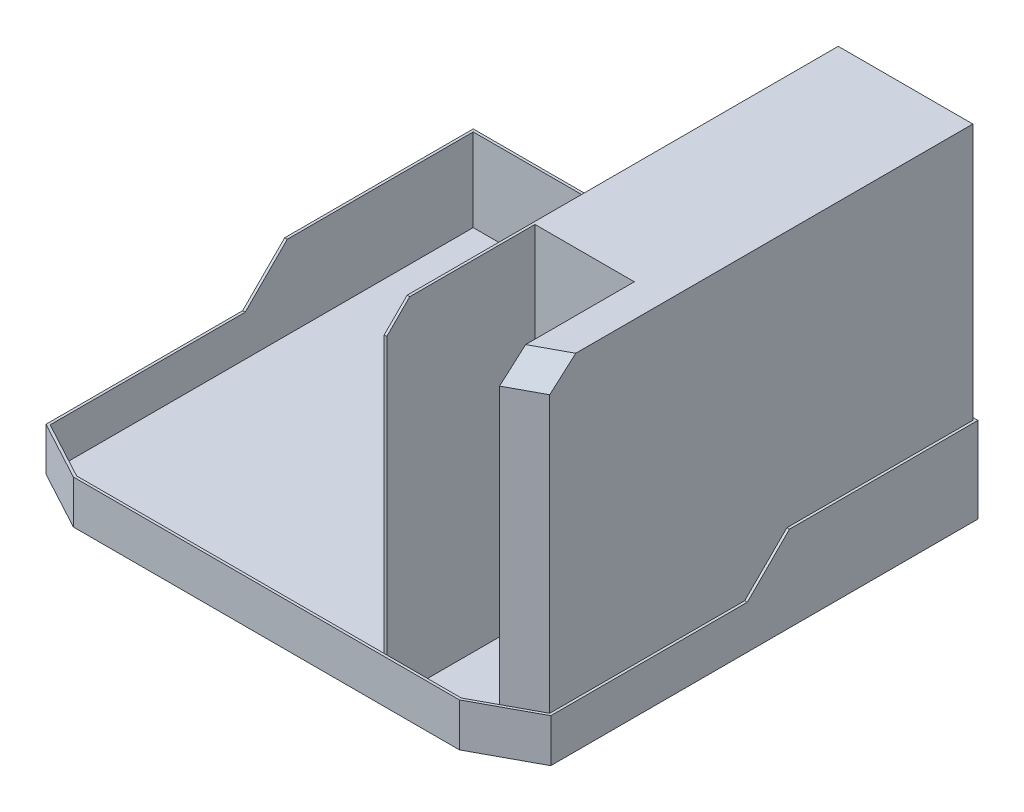
ISO-10303-21;
HEADER;
FILE_DESCRIPTION(('STEP AP214'),'2;1');
FILE_NAME('part.step','',(''),(''),'','','');
FILE_SCHEMA(('AUTOMOTIVE_DESIGN { 1 0 10303 214 1 1 1 1 }'));
ENDSEC;
DATA;
#1=APPLICATION_CONTEXT('core data for automotive mechanical design processes');
#2=APPLICATION_PROTOCOL_DEFINITION('international standard','automotive_design',2000,#1);
#3=PRODUCT_CONTEXT('',#1,'mechanical');
#4=PRODUCT('Part','Part','',(#3));
#5=PRODUCT_RELATED_PRODUCT_CATEGORY('part','',(#4));
#6=PRODUCT_DEFINITION_FORMATION('','',#4);
#7=PRODUCT_DEFINITION_CONTEXT('part definition',#1,'design');
#8=PRODUCT_DEFINITION('design','',#6,#7);
#9=PRODUCT_DEFINITION_SHAPE('','',#8);
#10=(LENGTH_UNIT() NAMED_UNIT(*) SI_UNIT(.MILLI.,.METRE.));
#11=(NAMED_UNIT(*) PLANE_ANGLE_UNIT() SI_UNIT($,.RADIAN.));
#12=(NAMED_UNIT(*) SI_UNIT($,.STERADIAN.) SOLID_ANGLE_UNIT());
#13=UNCERTAINTY_MEASURE_WITH_UNIT(LENGTH_MEASURE(1.E-05),#10,'distance_accuracy_value','');
#14=(GEOMETRIC_REPRESENTATION_CONTEXT(3) GLOBAL_UNCERTAINTY_ASSIGNED_CONTEXT((#13)) GLOBAL_UNIT_ASSIGNED_CONTEXT((#10,
#11,#12)) REPRESENTATION_CONTEXT('',''));
#15=CARTESIAN_POINT('',(0.,0.,0.));
#16=DIRECTION('',(0.,0.,1.));
#17=DIRECTION('',(1.,0.,0.));
#18=AXIS2_PLACEMENT_3D('',#15,#16,#17);
#19=CARTESIAN_POINT('',(319.645467286542,1040.95052293774,298.741286605758));
#20=DIRECTION('',(-0.474433603571063,0.,-0.880291290313936));
#21=DIRECTION('',(-0.880291290313937,0.,0.474433603571063));
#22=AXIS2_PLACEMENT_3D('',#19,#20,#21);
#23=PLANE('',#22);
#24=DIRECTION('',(0.880291290313937,0.,-0.474433603571063));
#25=VECTOR('',#24,1.);
#26=CARTESIAN_POINT('',(319.645467286542,50.,298.741286605758));
#27=LINE('',#26,#25);
#28=CARTESIAN_POINT('',(320.351791073946,50.,298.360612908956));
#29=VERTEX_POINT('',#28);
#30=CARTESIAN_POINT('',(350.876220457634,50.0000000001251,281.909450448529));
#31=VERTEX_POINT('',#30);
#32=EDGE_CURVE('E355',#29,#31,#27,.T.);
#33=ORIENTED_EDGE('',*,*,#32,.T.);
#34=DIRECTION('',(0.,-1.,0.));
#35=VECTOR('',#34,1.);
#36=CARTESIAN_POINT('',(350.876220457634,500000.,281.909450448529));
#37=LINE('',#36,#35);
#38=CARTESIAN_POINT('',(350.876220457634,0.,281.909450448529));
#39=VERTEX_POINT('',#38);
#40=EDGE_CURVE('E300',#31,#39,#37,.T.);
#41=ORIENTED_EDGE('',*,*,#40,.T.);
#42=DIRECTION('',(0.880291290313937,0.,-0.474433603571063));
#43=VECTOR('',#42,1.);
#44=CARTESIAN_POINT('',(319.645467286542,0.,298.741286605758));
#45=LINE('',#44,#43);
#46=CARTESIAN_POINT('',(320.351791073946,0.,298.360612908956));
#47=VERTEX_POINT('',#46);
#48=EDGE_CURVE('E235',#47,#39,#45,.T.);
#49=ORIENTED_EDGE('',*,*,#48,.F.);
#50=DIRECTION('',(0.,-1.,0.));
#51=VECTOR('',#50,1.);
#52=CARTESIAN_POINT('',(320.351791073946,1040.95052293774,298.360612908956));
#53=LINE('',#52,#51);
#54=EDGE_CURVE('E37',#29,#47,#53,.T.);
#55=ORIENTED_EDGE('',*,*,#54,.F.);
#56=EDGE_LOOP('',(#33,#41,#49,#55));
#57=FACE_BOUND('',#56,.T.);
#58=ADVANCED_FACE('F33',(#57),#23,.T.);
#59=CARTESIAN_POINT('',(-152.747945688264,1040.95052293774,298.360612908956));
#60=DIRECTION('',(0.,0.,-1.));
#61=DIRECTION('',(-1.,0.,0.));
#62=AXIS2_PLACEMENT_3D('',#59,#60,#61);
#63=PLANE('',#62);
#64=DIRECTION('',(1.,0.,0.));
#65=VECTOR('',#64,1.);
#66=CARTESIAN_POINT('',(-152.747945688264,50.,298.360612908956));
#67=LINE('',#66,#65);
#68=CARTESIAN_POINT('',(-151.945570616313,50.,298.360612908956));
#69=VERTEX_POINT('',#68);
#70=CARTESIAN_POINT('',(225.65,50.0000000001251,298.360612908956));
#71=VERTEX_POINT('',#70);
#72=EDGE_CURVE('E351',#69,#71,#67,.T.);
#73=ORIENTED_EDGE('',*,*,#72,.T.);
#74=DIRECTION('',(0.,-1.,0.));
#75=VECTOR('',#74,1.);
#76=CARTESIAN_POINT('',(225.65,500000.,298.360612908956));
#77=LINE('',#76,#75);
#78=CARTESIAN_POINT('',(225.65,0.,298.360612908956));
#79=VERTEX_POINT('',#78);
#80=EDGE_CURVE('E257',#71,#79,#77,.T.);
#81=ORIENTED_EDGE('',*,*,#80,.T.);
#82=DIRECTION('',(1.,0.,0.));
#83=VECTOR('',#82,1.);
#84=CARTESIAN_POINT('',(-152.747945688264,0.,298.360612908956));
#85=LINE('',#84,#83);
#86=CARTESIAN_POINT('',(-151.945570616313,0.,298.360612908956));
#87=VERTEX_POINT('',#86);
#88=EDGE_CURVE('E336',#87,#79,#85,.T.);
#89=ORIENTED_EDGE('',*,*,#88,.F.);
#90=DIRECTION('',(0.,-1.,0.));
#91=VECTOR('',#90,1.);
#92=CARTESIAN_POINT('',(-151.945570616313,1040.95052293774,298.360612908956));
#93=LINE('',#92,#91);
#94=EDGE_CURVE('E339',#69,#87,#93,.T.);
#95=ORIENTED_EDGE('',*,*,#94,.F.);
#96=EDGE_LOOP('',(#73,#81,#89,#95));
#97=FACE_BOUND('',#96,.T.);
#98=ADVANCED_FACE('F424',(#97),#63,.T.);
#99=CARTESIAN_POINT('',(228.83,0.,298.360612908956));
#100=VERTEX_POINT('',#99);
#101=EDGE_CURVE('E334',#100,#47,#85,.T.);
#102=ORIENTED_EDGE('',*,*,#101,.F.);
#103=DIRECTION('',(0.,1.,0.));
#104=VECTOR('',#103,1.);
#105=CARTESIAN_POINT('',(228.83,500000.,298.360612908956));
#106=LINE('',#105,#104);
#107=CARTESIAN_POINT('',(228.83,50.0000000000114,298.360612908956));
#108=VERTEX_POINT('',#107);
#109=EDGE_CURVE('E297',#100,#108,#106,.T.);
#110=ORIENTED_EDGE('',*,*,#109,.T.);
#111=EDGE_CURVE('E354',#108,#29,#67,.T.);
#112=ORIENTED_EDGE('',*,*,#111,.T.);
#113=ORIENTED_EDGE('',*,*,#54,.T.);
#114=EDGE_LOOP('',(#102,#110,#112,#113));
#115=FACE_BOUND('',#114,.T.);
#116=ADVANCED_FACE('F447',(#115),#63,.T.);
#117=CARTESIAN_POINT('',(-225.65,370.,-259.07));
#118=DIRECTION('',(0.,0.,-1.));
#119=DIRECTION('',(-1.,0.,0.));
#120=AXIS2_PLACEMENT_3D('',#117,#118,#119);
#121=PLANE('',#120);
#122=DIRECTION('',(0.,-1.,0.));
#123=VECTOR('',#122,1.);
#124=CARTESIAN_POINT('',(225.65,500000.,-259.07));
#125=LINE('',#124,#123);
#126=CARTESIAN_POINT('',(225.65,101.74781650943,-259.07));
#127=VERTEX_POINT('',#126);
#128=CARTESIAN_POINT('',(225.65,0.,-259.07));
#129=VERTEX_POINT('',#128);
#130=EDGE_CURVE('E263',#127,#129,#125,.T.);
#131=ORIENTED_EDGE('',*,*,#130,.F.);
#132=DIRECTION('',(1.,0.,0.));
#133=VECTOR('',#132,1.);
#134=CARTESIAN_POINT('',(-225.65,101.747816509296,-259.07));
#135=LINE('',#134,#133);
#136=CARTESIAN_POINT('',(-222.47,101.747816509296,-259.07));
#137=VERTEX_POINT('',#136);
#138=EDGE_CURVE('E331',#137,#127,#135,.T.);
#139=ORIENTED_EDGE('',*,*,#138,.F.);
#140=DIRECTION('',(0.,-1.,0.));
#141=VECTOR('',#140,1.);
#142=CARTESIAN_POINT('',(-222.47,370.,-259.07));
#143=LINE('',#142,#141);
#144=CARTESIAN_POINT('',(-222.47,0.,-259.07));
#145=VERTEX_POINT('',#144);
#146=EDGE_CURVE('E344',#137,#145,#143,.T.);
#147=ORIENTED_EDGE('',*,*,#146,.T.);
#148=DIRECTION('',(1.,0.,0.));
#149=VECTOR('',#148,1.);
#150=CARTESIAN_POINT('',(-225.65,0.,-259.07));
#151=LINE('',#150,#149);
#152=EDGE_CURVE('E341',#145,#129,#151,.T.);
#153=ORIENTED_EDGE('',*,*,#152,.T.);
#154=EDGE_LOOP('',(#131,#139,#147,#153));
#155=FACE_BOUND('',#154,.T.);
#156=ADVANCED_FACE('F482',(#155),#121,.F.);
#157=CARTESIAN_POINT('',(0.,0.,0.));
#158=DIRECTION('',(0.,1.,0.));
#159=DIRECTION('',(0.,0.,1.));
#160=AXIS2_PLACEMENT_3D('',#157,#158,#159);
#161=PLANE('',#160);
#162=DIRECTION('',(0.,0.,1.));
#163=VECTOR('',#162,1.);
#164=CARTESIAN_POINT('',(225.65,0.,262.25));
#165=LINE('',#164,#163);
#166=CARTESIAN_POINT('',(225.65,0.,262.25));
#167=VERTEX_POINT('',#166);
#168=EDGE_CURVE('E252',#167,#79,#165,.T.);
#169=ORIENTED_EDGE('',*,*,#168,.F.);
#170=DIRECTION('',(0.,0.,1.));
#171=VECTOR('',#170,1.);
#172=CARTESIAN_POINT('',(225.65,0.,-259.07));
#173=LINE('',#172,#171);
#174=EDGE_CURVE('E249',#129,#167,#173,.T.);
#175=ORIENTED_EDGE('',*,*,#174,.F.);
#176=ORIENTED_EDGE('',*,*,#152,.F.);
#177=DIRECTION('',(0.,0.,1.));
#178=VECTOR('',#177,1.);
#179=CARTESIAN_POINT('',(-222.47,0.,-262.25));
#180=LINE('',#179,#178);
#181=CARTESIAN_POINT('',(-222.47,0.,260.351422609727));
#182=VERTEX_POINT('',#181);
#183=EDGE_CURVE('E335',#145,#182,#180,.T.);
#184=ORIENTED_EDGE('',*,*,#183,.T.);
#185=DIRECTION('',(0.880291290313936,0.,0.474433603571064));
#186=VECTOR('',#185,1.);
#187=CARTESIAN_POINT('',(-224.141301140644,0.,259.450673696802));
#188=LINE('',#187,#186);
#189=EDGE_CURVE('E332',#182,#87,#188,.T.);
#190=ORIENTED_EDGE('',*,*,#189,.T.);
#191=ORIENTED_EDGE('',*,*,#88,.T.);
#192=EDGE_LOOP('',(#169,#175,#176,#184,#190,#191));
#193=FACE_BOUND('',#192,.T.);
#194=ADVANCED_FACE('F427',(#193),#161,.T.);
#195=DIRECTION('',(1.,0.,0.));
#196=VECTOR('',#195,1.);
#197=CARTESIAN_POINT('',(228.83,0.,116.46438862178));
#198=LINE('',#197,#196);
#199=CARTESIAN_POINT('',(228.83,0.,116.46438862178));
#200=VERTEX_POINT('',#199);
#201=CARTESIAN_POINT('',(350.876220457634,0.,116.46438862178));
#202=VERTEX_POINT('',#201);
#203=EDGE_CURVE('E228',#200,#202,#198,.T.);
#204=ORIENTED_EDGE('',*,*,#203,.F.);
#205=DIRECTION('',(0.,0.,-1.));
#206=VECTOR('',#205,1.);
#207=CARTESIAN_POINT('',(228.83,0.,116.46438862178));
#208=LINE('',#207,#206);
#209=EDGE_CURVE('E50',#100,#200,#208,.T.);
#210=ORIENTED_EDGE('',*,*,#209,.F.);
#211=ORIENTED_EDGE('',*,*,#101,.T.);
#212=ORIENTED_EDGE('',*,*,#48,.T.);
#213=DIRECTION('',(0.,0.,1.));
#214=VECTOR('',#213,1.);
#215=CARTESIAN_POINT('',(350.876220457634,0.,116.46438862178));
#216=LINE('',#215,#214);
#217=EDGE_CURVE('E218',#202,#39,#216,.T.);
#218=ORIENTED_EDGE('',*,*,#217,.F.);
#219=EDGE_LOOP('',(#204,#210,#211,#212,#218));
#220=FACE_BOUND('',#219,.T.);
#221=ADVANCED_FACE('F233',(#220),#161,.T.);
#222=CARTESIAN_POINT('',(394.066220457634,101.747816509296,-30.8178165092128));
#223=DIRECTION('',(0.,1.,0.));
#224=DIRECTION('',(0.,0.,1.));
#225=AXIS2_PLACEMENT_3D('',#222,#223,#224);
#226=PLANE('',#225);
#227=DIRECTION('',(-1.,0.,0.));
#228=VECTOR('',#227,1.);
#229=CARTESIAN_POINT('',(394.066220457634,101.747816509296,-30.8178165092128));
#230=LINE('',#229,#228);
#231=CARTESIAN_POINT('',(394.056220457634,101.747816509296,-30.8178165092127));
#232=VERTEX_POINT('',#231);
#233=CARTESIAN_POINT('',(390.876220457634,101.747816509296,-30.8178165092127));
#234=VERTEX_POINT('',#233);
#235=EDGE_CURVE('E42',#232,#234,#230,.T.);
#236=ORIENTED_EDGE('',*,*,#235,.F.);
#237=DIRECTION('',(0.,0.,-1.));
#238=VECTOR('',#237,1.);
#239=CARTESIAN_POINT('',(394.056220457634,101.747816509296,262.25));
#240=LINE('',#239,#238);
#241=CARTESIAN_POINT('',(394.056220457634,101.747816509296,-262.25));
#242=VERTEX_POINT('',#241);
#243=EDGE_CURVE('E390',#232,#242,#240,.T.);
#244=ORIENTED_EDGE('',*,*,#243,.T.);
#245=DIRECTION('',(1.,0.,0.));
#246=VECTOR('',#245,1.);
#247=CARTESIAN_POINT('',(-225.65,101.747816509296,-262.25));
#248=LINE('',#247,#246);
#249=CARTESIAN_POINT('',(-225.65,101.747816509296,-262.25));
#250=VERTEX_POINT('',#249);
#251=EDGE_CURVE('E373',#250,#242,#248,.T.);
#252=ORIENTED_EDGE('',*,*,#251,.F.);
#253=DIRECTION('',(0.,0.,1.));
#254=VECTOR('',#253,1.);
#255=CARTESIAN_POINT('',(-225.65,101.747816509296,-262.25));
#256=LINE('',#255,#254);
#257=CARTESIAN_POINT('',(-225.65,101.747816509296,-30.8178165092128));
#258=VERTEX_POINT('',#257);
#259=EDGE_CURVE('E381',#250,#258,#256,.T.);
#260=ORIENTED_EDGE('',*,*,#259,.T.);
#261=CARTESIAN_POINT('',(-222.47,101.747816509296,-30.8178165092128));
#262=VERTEX_POINT('',#261);
#263=EDGE_CURVE('E11',#262,#258,#230,.T.);
#264=ORIENTED_EDGE('',*,*,#263,.F.);
#265=DIRECTION('',(0.,0.,1.));
#266=VECTOR('',#265,1.);
#267=CARTESIAN_POINT('',(-222.47,101.747816509296,-262.25));
#268=LINE('',#267,#266);
#269=EDGE_CURVE('E364',#137,#262,#268,.T.);
#270=ORIENTED_EDGE('',*,*,#269,.F.);
#271=ORIENTED_EDGE('',*,*,#138,.T.);
#272=DIRECTION('',(1.,0.,0.));
#273=VECTOR('',#272,1.);
#274=CARTESIAN_POINT('',(394.066220457634,101.747816509296,-259.07));
#275=LINE('',#274,#273);
#276=CARTESIAN_POINT('',(390.876220457634,101.74781650943,-259.07));
#277=VERTEX_POINT('',#276);
#278=EDGE_CURVE('E304',#127,#277,#275,.T.);
#279=ORIENTED_EDGE('',*,*,#278,.T.);
#280=DIRECTION('',(0.,0.,-1.));
#281=VECTOR('',#280,1.);
#282=CARTESIAN_POINT('',(390.876220457634,101.747816509296,262.25));
#283=LINE('',#282,#281);
#284=EDGE_CURVE('E358',#234,#277,#283,.T.);
#285=ORIENTED_EDGE('',*,*,#284,.F.);
#286=EDGE_LOOP('',(#236,#244,#252,#260,#264,#270,#271,#279,#285));
#287=FACE_BOUND('',#286,.T.);
#288=ADVANCED_FACE('F486',(#287),#226,.T.);
#289=CARTESIAN_POINT('',(394.066220457634,50.,20.9300000000832));
#290=DIRECTION('',(0.,1.,0.));
#291=DIRECTION('',(0.,0.,1.));
#292=AXIS2_PLACEMENT_3D('',#289,#290,#291);
#293=PLANE('',#292);
#294=DIRECTION('',(0.880291290313937,0.,-0.474433603571063));
#295=VECTOR('',#294,1.);
#296=CARTESIAN_POINT('',(321.154166145898,50.,301.540612908956));
#297=LINE('',#296,#295);
#298=CARTESIAN_POINT('',(321.154166145898,50.,301.540612908956));
#299=VERTEX_POINT('',#298);
#300=CARTESIAN_POINT('',(394.056220457634,50.,262.25));
#301=VERTEX_POINT('',#300);
#302=EDGE_CURVE('E393',#299,#301,#297,.T.);
#303=ORIENTED_EDGE('',*,*,#302,.T.);
#304=DIRECTION('',(0.,0.,-1.));
#305=VECTOR('',#304,1.);
#306=CARTESIAN_POINT('',(394.056220457634,50.,262.25));
#307=LINE('',#306,#305);
#308=CARTESIAN_POINT('',(394.056220457634,50.,20.9300000000832));
#309=VERTEX_POINT('',#308);
#310=EDGE_CURVE('E384',#301,#309,#307,.T.);
#311=ORIENTED_EDGE('',*,*,#310,.T.);
#312=DIRECTION('',(-1.,0.,0.));
#313=VECTOR('',#312,1.);
#314=CARTESIAN_POINT('',(394.066220457634,50.,20.9300000000832));
#315=LINE('',#314,#313);
#316=CARTESIAN_POINT('',(390.876220457634,50.,20.9300000000831));
#317=VERTEX_POINT('',#316);
#318=EDGE_CURVE('E348',#309,#317,#315,.T.);
#319=ORIENTED_EDGE('',*,*,#318,.T.);
#320=DIRECTION('',(0.,0.,-1.));
#321=VECTOR('',#320,1.);
#322=CARTESIAN_POINT('',(390.876220457634,50.,262.25));
#323=LINE('',#322,#321);
#324=CARTESIAN_POINT('',(390.876220457634,50.0000000001251,260.351422609727));
#325=VERTEX_POINT('',#324);
#326=EDGE_CURVE('E362',#325,#317,#323,.T.);
#327=ORIENTED_EDGE('',*,*,#326,.F.);
#328=DIRECTION('',(-0.880291290313937,0.,0.474433603571063));
#329=VECTOR('',#328,1.);
#330=CARTESIAN_POINT('',(493.340099794362,50.,205.128443529407));
#331=LINE('',#330,#329);
#332=EDGE_CURVE('E310',#325,#31,#331,.T.);
#333=ORIENTED_EDGE('',*,*,#332,.T.);
#334=ORIENTED_EDGE('',*,*,#32,.F.);
#335=ORIENTED_EDGE('',*,*,#111,.F.);
#336=DIRECTION('',(-1.,0.,0.));
#337=VECTOR('',#336,1.);
#338=CARTESIAN_POINT('',(394.066220457634,50.,298.360612908956));
#339=LINE('',#338,#337);
#340=EDGE_CURVE('E307',#108,#71,#339,.T.);
#341=ORIENTED_EDGE('',*,*,#340,.T.);
#342=ORIENTED_EDGE('',*,*,#72,.F.);
#343=DIRECTION('',(0.880291290313936,0.,0.474433603571064));
#344=VECTOR('',#343,1.);
#345=CARTESIAN_POINT('',(-224.141301140644,50.,259.450673696802));
#346=LINE('',#345,#344);
#347=CARTESIAN_POINT('',(-222.47,50.,260.351422609727));
#348=VERTEX_POINT('',#347);
#349=EDGE_CURVE('E58',#348,#69,#346,.T.);
#350=ORIENTED_EDGE('',*,*,#349,.F.);
#351=DIRECTION('',(0.,0.,1.));
#352=VECTOR('',#351,1.);
#353=CARTESIAN_POINT('',(-222.47,50.,-262.25));
#354=LINE('',#353,#352);
#355=CARTESIAN_POINT('',(-222.47,50.,20.9300000000832));
#356=VERTEX_POINT('',#355);
#357=EDGE_CURVE('E370',#356,#348,#354,.T.);
#358=ORIENTED_EDGE('',*,*,#357,.F.);
#359=CARTESIAN_POINT('',(-225.65,50.,20.9300000000832));
#360=VERTEX_POINT('',#359);
#361=EDGE_CURVE('E346',#356,#360,#315,.T.);
#362=ORIENTED_EDGE('',*,*,#361,.T.);
#363=DIRECTION('',(0.,0.,1.));
#364=VECTOR('',#363,1.);
#365=CARTESIAN_POINT('',(-225.65,50.,-262.25));
#366=LINE('',#365,#364);
#367=CARTESIAN_POINT('',(-225.65,50.,262.25));
#368=VERTEX_POINT('',#367);
#369=EDGE_CURVE('E375',#360,#368,#366,.T.);
#370=ORIENTED_EDGE('',*,*,#369,.T.);
#371=DIRECTION('',(0.880291290313936,0.,0.474433603571064));
#372=VECTOR('',#371,1.);
#373=CARTESIAN_POINT('',(-225.65,50.,262.25));
#374=LINE('',#373,#372);
#375=CARTESIAN_POINT('',(-152.747945688264,50.,301.540612908956));
#376=VERTEX_POINT('',#375);
#377=EDGE_CURVE('E399',#368,#376,#374,.T.);
#378=ORIENTED_EDGE('',*,*,#377,.T.);
#379=DIRECTION('',(1.,0.,0.));
#380=VECTOR('',#379,1.);
#381=CARTESIAN_POINT('',(-152.747945688264,50.,301.540612908956));
#382=LINE('',#381,#380);
#383=EDGE_CURVE('E396',#376,#299,#382,.T.);
#384=ORIENTED_EDGE('',*,*,#383,.T.);
#385=EDGE_LOOP('',(#303,#311,#319,#327,#333,#334,#335,#341,#342,#350,#358,#362,#370,#378,#384));
#386=FACE_BOUND('',#385,.T.);
#387=ADVANCED_FACE('F435',(#386),#293,.T.);
#388=CARTESIAN_POINT('',(394.066220457634,101.747816509296,-30.8178165092128));
#389=DIRECTION('',(0.,0.707106781186548,0.707106781186548));
#390=DIRECTION('',(0.,-0.707106781186548,0.707106781186548));
#391=AXIS2_PLACEMENT_3D('',#388,#389,#390);
#392=PLANE('',#391);
#393=ORIENTED_EDGE('',*,*,#318,.F.);
#394=DIRECTION('',(0.,0.707106781186548,-0.707106781186548));
#395=VECTOR('',#394,1.);
#396=CARTESIAN_POINT('',(394.056220457634,89.3400000000416,-18.4099999999583));
#397=LINE('',#396,#395);
#398=EDGE_CURVE('E387',#309,#232,#397,.T.);
#399=ORIENTED_EDGE('',*,*,#398,.T.);
#400=ORIENTED_EDGE('',*,*,#235,.T.);
#401=DIRECTION('',(0.,0.707106781186548,-0.707106781186548));
#402=VECTOR('',#401,1.);
#403=CARTESIAN_POINT('',(390.876220457634,89.3400000000416,-18.4099999999583));
#404=LINE('',#403,#402);
#405=EDGE_CURVE('E360',#317,#234,#404,.T.);
#406=ORIENTED_EDGE('',*,*,#405,.F.);
#407=EDGE_LOOP('',(#393,#399,#400,#406));
#408=FACE_BOUND('',#407,.T.);
#409=ADVANCED_FACE('F515',(#408),#392,.T.);
#410=DIRECTION('',(0.,-0.707106781186548,0.707106781186548));
#411=VECTOR('',#410,1.);
#412=CARTESIAN_POINT('',(-222.47,351.590000000042,-280.659999999958));
#413=LINE('',#412,#411);
#414=EDGE_CURVE('E367',#262,#356,#413,.T.);
#415=ORIENTED_EDGE('',*,*,#414,.F.);
#416=ORIENTED_EDGE('',*,*,#263,.T.);
#417=DIRECTION('',(0.,-0.707106781186548,0.707106781186548));
#418=VECTOR('',#417,1.);
#419=CARTESIAN_POINT('',(-225.65,351.590000000042,-280.659999999958));
#420=LINE('',#419,#418);
#421=EDGE_CURVE('E378',#258,#360,#420,.T.);
#422=ORIENTED_EDGE('',*,*,#421,.T.);
#423=ORIENTED_EDGE('',*,*,#361,.F.);
#424=EDGE_LOOP('',(#415,#416,#422,#423));
#425=FACE_BOUND('',#424,.T.);
#426=ADVANCED_FACE('F490',(#425),#392,.T.);
#427=CARTESIAN_POINT('',(394.056220457634,370.,262.25));
#428=DIRECTION('',(-1.,0.,0.));
#429=DIRECTION('',(0.,0.,1.));
#430=AXIS2_PLACEMENT_3D('',#427,#428,#429);
#431=PLANE('',#430);
#432=ORIENTED_EDGE('',*,*,#310,.F.);
#433=DIRECTION('',(0.,-1.,0.));
#434=VECTOR('',#433,1.);
#435=CARTESIAN_POINT('',(394.056220457634,370.,262.25));
#436=LINE('',#435,#434);
#437=CARTESIAN_POINT('',(394.056220457634,-3.18,262.25));
#438=VERTEX_POINT('',#437);
#439=EDGE_CURVE('E405',#301,#438,#436,.T.);
#440=ORIENTED_EDGE('',*,*,#439,.T.);
#441=DIRECTION('',(0.,0.,1.));
#442=VECTOR('',#441,1.);
#443=CARTESIAN_POINT('',(394.056220457634,-3.18,262.25));
#444=LINE('',#443,#442);
#445=CARTESIAN_POINT('',(394.056220457634,-3.18,-262.25));
#446=VERTEX_POINT('',#445);
#447=EDGE_CURVE('E328',#446,#438,#444,.T.);
#448=ORIENTED_EDGE('',*,*,#447,.F.);
#449=DIRECTION('',(0.,-1.,0.));
#450=VECTOR('',#449,1.);
#451=CARTESIAN_POINT('',(394.056220457634,370.,-262.25));
#452=LINE('',#451,#450);
#453=EDGE_CURVE('E407',#242,#446,#452,.T.);
#454=ORIENTED_EDGE('',*,*,#453,.F.);
#455=ORIENTED_EDGE('',*,*,#243,.F.);
#456=ORIENTED_EDGE('',*,*,#398,.F.);
#457=EDGE_LOOP('',(#432,#440,#448,#454,#455,#456));
#458=FACE_BOUND('',#457,.T.);
#459=ADVANCED_FACE('F511',(#458),#431,.F.);
#460=CARTESIAN_POINT('',(321.154166145898,1040.95052293774,301.540612908956));
#461=DIRECTION('',(-0.474433603571063,0.,-0.880291290313936));
#462=DIRECTION('',(-0.880291290313937,0.,0.474433603571063));
#463=AXIS2_PLACEMENT_3D('',#460,#461,#462);
#464=PLANE('',#463);
#465=ORIENTED_EDGE('',*,*,#302,.F.);
#466=DIRECTION('',(0.,-1.,0.));
#467=VECTOR('',#466,1.);
#468=CARTESIAN_POINT('',(321.154166145898,1040.95052293774,301.540612908956));
#469=LINE('',#468,#467);
#470=CARTESIAN_POINT('',(321.154166145898,-3.18,301.540612908956));
#471=VERTEX_POINT('',#470);
#472=EDGE_CURVE('E413',#299,#471,#469,.T.);
#473=ORIENTED_EDGE('',*,*,#472,.T.);
#474=DIRECTION('',(-0.880291290313936,0.,0.474433603571063));
#475=VECTOR('',#474,1.);
#476=CARTESIAN_POINT('',(321.154166145898,-3.18,301.540612908956));
#477=LINE('',#476,#475);
#478=EDGE_CURVE('E313',#438,#471,#477,.T.);
#479=ORIENTED_EDGE('',*,*,#478,.F.);
#480=ORIENTED_EDGE('',*,*,#439,.F.);
#481=EDGE_LOOP('',(#465,#473,#479,#480));
#482=FACE_BOUND('',#481,.T.);
#483=ADVANCED_FACE('F506',(#482),#464,.F.);
#484=CARTESIAN_POINT('',(-152.747945688264,1040.95052293774,301.540612908956));
#485=DIRECTION('',(0.,0.,-1.));
#486=DIRECTION('',(-1.,0.,0.));
#487=AXIS2_PLACEMENT_3D('',#484,#485,#486);
#488=PLANE('',#487);
#489=ORIENTED_EDGE('',*,*,#383,.F.);
#490=DIRECTION('',(0.,-1.,0.));
#491=VECTOR('',#490,1.);
#492=CARTESIAN_POINT('',(-152.747945688264,1040.95052293774,301.540612908956));
#493=LINE('',#492,#491);
#494=CARTESIAN_POINT('',(-152.747945688264,-3.18,301.540612908956));
#495=VERTEX_POINT('',#494);
#496=EDGE_CURVE('E411',#376,#495,#493,.T.);
#497=ORIENTED_EDGE('',*,*,#496,.T.);
#498=DIRECTION('',(-1.,0.,0.));
#499=VECTOR('',#498,1.);
#500=CARTESIAN_POINT('',(-152.747945688264,-3.18,301.540612908956));
#501=LINE('',#500,#499);
#502=EDGE_CURVE('E316',#471,#495,#501,.T.);
#503=ORIENTED_EDGE('',*,*,#502,.F.);
#504=ORIENTED_EDGE('',*,*,#472,.F.);
#505=EDGE_LOOP('',(#489,#497,#503,#504));
#506=FACE_BOUND('',#505,.T.);
#507=ADVANCED_FACE('F502',(#506),#488,.F.);
#508=CARTESIAN_POINT('',(-222.47,370.,-262.25));
#509=DIRECTION('',(1.,0.,0.));
#510=DIRECTION('',(0.,0.,-1.));
#511=AXIS2_PLACEMENT_3D('',#508,#509,#510);
#512=PLANE('',#511);
#513=ORIENTED_EDGE('',*,*,#414,.T.);
#514=ORIENTED_EDGE('',*,*,#357,.T.);
#515=DIRECTION('',(0.,-1.,0.));
#516=VECTOR('',#515,1.);
#517=CARTESIAN_POINT('',(-222.47,1040.95052293774,260.351422609727));
#518=LINE('',#517,#516);
#519=EDGE_CURVE('E415',#348,#182,#518,.T.);
#520=ORIENTED_EDGE('',*,*,#519,.T.);
#521=ORIENTED_EDGE('',*,*,#183,.F.);
#522=ORIENTED_EDGE('',*,*,#146,.F.);
#523=ORIENTED_EDGE('',*,*,#269,.T.);
#524=EDGE_LOOP('',(#513,#514,#520,#521,#522,#523));
#525=FACE_BOUND('',#524,.T.);
#526=ADVANCED_FACE('F431',(#525),#512,.T.);
#527=CARTESIAN_POINT('',(-224.141301140644,1040.95052293774,259.450673696802));
#528=DIRECTION('',(0.474433603571064,0.,-0.880291290313936));
#529=DIRECTION('',(-0.880291290313936,0.,-0.474433603571064));
#530=AXIS2_PLACEMENT_3D('',#527,#528,#529);
#531=PLANE('',#530);
#532=ORIENTED_EDGE('',*,*,#519,.F.);
#533=ORIENTED_EDGE('',*,*,#349,.T.);
#534=ORIENTED_EDGE('',*,*,#94,.T.);
#535=ORIENTED_EDGE('',*,*,#189,.F.);
#536=EDGE_LOOP('',(#532,#533,#534,#535));
#537=FACE_BOUND('',#536,.T.);
#538=ADVANCED_FACE('F35',(#537),#531,.T.);
#539=CARTESIAN_POINT('',(-225.65,370.,-262.25));
#540=DIRECTION('',(1.,0.,0.));
#541=DIRECTION('',(0.,0.,-1.));
#542=AXIS2_PLACEMENT_3D('',#539,#540,#541);
#543=PLANE('',#542);
#544=ORIENTED_EDGE('',*,*,#369,.F.);
#545=ORIENTED_EDGE('',*,*,#421,.F.);
#546=ORIENTED_EDGE('',*,*,#259,.F.);
#547=DIRECTION('',(0.,-1.,0.));
#548=VECTOR('',#547,1.);
#549=CARTESIAN_POINT('',(-225.65,370.,-262.25));
#550=LINE('',#549,#548);
#551=CARTESIAN_POINT('',(-225.65,-3.18,-262.25));
#552=VERTEX_POINT('',#551);
#553=EDGE_CURVE('E409',#250,#552,#550,.T.);
#554=ORIENTED_EDGE('',*,*,#553,.T.);
#555=DIRECTION('',(0.,0.,-1.));
#556=VECTOR('',#555,1.);
#557=CARTESIAN_POINT('',(-225.65,-3.18,-262.25));
#558=LINE('',#557,#556);
#559=CARTESIAN_POINT('',(-225.65,-3.18,262.25));
#560=VERTEX_POINT('',#559);
#561=EDGE_CURVE('E322',#560,#552,#558,.T.);
#562=ORIENTED_EDGE('',*,*,#561,.F.);
#563=DIRECTION('',(0.,-1.,0.));
#564=VECTOR('',#563,1.);
#565=CARTESIAN_POINT('',(-225.65,370.,262.25));
#566=LINE('',#565,#564);
#567=EDGE_CURVE('E350',#368,#560,#566,.T.);
#568=ORIENTED_EDGE('',*,*,#567,.F.);
#569=EDGE_LOOP('',(#544,#545,#546,#554,#562,#568));
#570=FACE_BOUND('',#569,.T.);
#571=ADVANCED_FACE('F493',(#570),#543,.F.);
#572=CARTESIAN_POINT('',(-225.65,1040.95052293774,262.25));
#573=DIRECTION('',(0.474433603571064,0.,-0.880291290313936));
#574=DIRECTION('',(-0.880291290313936,0.,-0.474433603571064));
#575=AXIS2_PLACEMENT_3D('',#572,#573,#574);
#576=PLANE('',#575);
#577=ORIENTED_EDGE('',*,*,#377,.F.);
#578=ORIENTED_EDGE('',*,*,#567,.T.);
#579=DIRECTION('',(-0.880291290313936,0.,-0.474433603571064));
#580=VECTOR('',#579,1.);
#581=CARTESIAN_POINT('',(-225.65,-3.18,262.25));
#582=LINE('',#581,#580);
#583=EDGE_CURVE('E319',#495,#560,#582,.T.);
#584=ORIENTED_EDGE('',*,*,#583,.F.);
#585=ORIENTED_EDGE('',*,*,#496,.F.);
#586=EDGE_LOOP('',(#577,#578,#584,#585));
#587=FACE_BOUND('',#586,.T.);
#588=ADVANCED_FACE('F497',(#587),#576,.F.);
#589=CARTESIAN_POINT('',(-225.65,370.,-262.25));
#590=DIRECTION('',(0.,0.,-1.));
#591=DIRECTION('',(-1.,0.,0.));
#592=AXIS2_PLACEMENT_3D('',#589,#590,#591);
#593=PLANE('',#592);
#594=ORIENTED_EDGE('',*,*,#553,.F.);
#595=ORIENTED_EDGE('',*,*,#251,.T.);
#596=ORIENTED_EDGE('',*,*,#453,.T.);
#597=DIRECTION('',(1.,0.,0.));
#598=VECTOR('',#597,1.);
#599=CARTESIAN_POINT('',(-225.65,-3.18,-262.25));
#600=LINE('',#599,#598);
#601=EDGE_CURVE('E325',#552,#446,#600,.T.);
#602=ORIENTED_EDGE('',*,*,#601,.F.);
#603=EDGE_LOOP('',(#594,#595,#596,#602));
#604=FACE_BOUND('',#603,.T.);
#605=ADVANCED_FACE('F545',(#604),#593,.T.);
#606=CARTESIAN_POINT('',(0.,-3.18,0.));
#607=DIRECTION('',(0.,1.,0.));
#608=DIRECTION('',(0.,0.,1.));
#609=AXIS2_PLACEMENT_3D('',#606,#607,#608);
#610=PLANE('',#609);
#611=ORIENTED_EDGE('',*,*,#478,.T.);
#612=ORIENTED_EDGE('',*,*,#502,.T.);
#613=ORIENTED_EDGE('',*,*,#583,.T.);
#614=ORIENTED_EDGE('',*,*,#561,.T.);
#615=ORIENTED_EDGE('',*,*,#601,.T.);
#616=ORIENTED_EDGE('',*,*,#447,.T.);
#617=EDGE_LOOP('',(#611,#612,#613,#614,#615,#616));
#618=FACE_BOUND('',#617,.T.);
#619=ADVANCED_FACE('F552',(#618),#610,.F.);
#620=CARTESIAN_POINT('',(182.92323885521,417.751400435827,339.406257795014));
#621=DIRECTION('',(0.33547521830787,0.707106781186544,0.622459940800443));
#622=DIRECTION('',(-0.880291290313937,0.,0.474433603571063));
#623=AXIS2_PLACEMENT_3D('',#620,#621,#622);
#624=PLANE('',#623);
#625=DIRECTION('',(0.,0.660751107356154,-0.750605072010319));
#626=VECTOR('',#625,1.);
#627=CARTESIAN_POINT('',(350.876220457634,372.857622963304,299.88665649666));
#628=LINE('',#627,#626);
#629=CARTESIAN_POINT('',(350.876220457634,388.682800871777,281.909450448529));
#630=VERTEX_POINT('',#629);
#631=CARTESIAN_POINT('',(350.876220457634,416.82,249.945940826263));
#632=VERTEX_POINT('',#631);
#633=EDGE_CURVE('E244',#630,#632,#628,.T.);
#634=ORIENTED_EDGE('',*,*,#633,.F.);
#635=DIRECTION('',(-0.880291290313936,0.,0.474433603571063));
#636=VECTOR('',#635,1.);
#637=CARTESIAN_POINT('',(196.714359297205,388.682800871653,364.995092812979));
#638=LINE('',#637,#636);
#639=CARTESIAN_POINT('',(390.876220457634,388.682800871777,260.351422609727));
#640=VERTEX_POINT('',#639);
#641=EDGE_CURVE('E270',#640,#630,#638,.T.);
#642=ORIENTED_EDGE('',*,*,#641,.F.);
#643=DIRECTION('',(0.,-0.660751107356154,0.750605072010319));
#644=VECTOR('',#643,1.);
#645=CARTESIAN_POINT('',(390.876220457634,362.165635945463,290.474593448704));
#646=LINE('',#645,#644);
#647=CARTESIAN_POINT('',(390.876220457634,416.82,228.387912987461));
#648=VERTEX_POINT('',#647);
#649=EDGE_CURVE('E282',#648,#640,#646,.T.);
#650=ORIENTED_EDGE('',*,*,#649,.F.);
#651=DIRECTION('',(0.880291290313936,0.,-0.474433603571063));
#652=VECTOR('',#651,1.);
#653=CARTESIAN_POINT('',(183.365126520347,416.82,340.226161486467));
#654=LINE('',#653,#652);
#655=EDGE_CURVE('E274',#632,#648,#654,.T.);
#656=ORIENTED_EDGE('',*,*,#655,.F.);
#657=EDGE_LOOP('',(#634,#642,#650,#656));
#658=FACE_BOUND('',#657,.T.);
#659=ADVANCED_FACE('F467',(#658),#624,.T.);
#660=CARTESIAN_POINT('',(0.,417.751400435827,269.292013344783));
#661=DIRECTION('',(0.,0.707106781186544,0.707106781186551));
#662=DIRECTION('',(-1.,0.,0.));
#663=AXIS2_PLACEMENT_3D('',#660,#661,#662);
#664=PLANE('',#663);
#665=DIRECTION('',(0.,-0.707106781186551,0.707106781186544));
#666=VECTOR('',#665,1.);
#667=CARTESIAN_POINT('',(228.83,417.751400435827,269.292013344783));
#668=LINE('',#667,#666);
#669=CARTESIAN_POINT('',(228.83,416.82,270.223413780609));
#670=VERTEX_POINT('',#669);
#671=CARTESIAN_POINT('',(228.83,388.682800871653,298.360612908956));
#672=VERTEX_POINT('',#671);
#673=EDGE_CURVE('E224',#670,#672,#668,.T.);
#674=ORIENTED_EDGE('',*,*,#673,.F.);
#675=DIRECTION('',(1.,0.,0.));
#676=VECTOR('',#675,1.);
#677=CARTESIAN_POINT('',(0.,416.82,270.223413780609));
#678=LINE('',#677,#676);
#679=CARTESIAN_POINT('',(225.65,416.819999999973,270.223413780609));
#680=VERTEX_POINT('',#679);
#681=EDGE_CURVE('E288',#680,#670,#678,.T.);
#682=ORIENTED_EDGE('',*,*,#681,.F.);
#683=DIRECTION('',(0.,-0.707106781186551,0.707106781186544));
#684=VECTOR('',#683,1.);
#685=CARTESIAN_POINT('',(225.65,250212.396706893,-249525.35329311));
#686=LINE('',#685,#684);
#687=CARTESIAN_POINT('',(225.65,388.682800871777,298.360612908956));
#688=VERTEX_POINT('',#687);
#689=EDGE_CURVE('E275',#680,#688,#686,.T.);
#690=ORIENTED_EDGE('',*,*,#689,.T.);
#691=DIRECTION('',(-1.,0.,0.));
#692=VECTOR('',#691,1.);
#693=CARTESIAN_POINT('',(0.,388.682800871653,298.360612908956));
#694=LINE('',#693,#692);
#695=EDGE_CURVE('E280',#672,#688,#694,.T.);
#696=ORIENTED_EDGE('',*,*,#695,.F.);
#697=EDGE_LOOP('',(#674,#682,#690,#696));
#698=FACE_BOUND('',#697,.T.);
#699=ADVANCED_FACE('F473',(#698),#664,.T.);
#700=CARTESIAN_POINT('',(0.,416.82,0.));
#701=DIRECTION('',(0.,1.,0.));
#702=DIRECTION('',(0.,0.,1.));
#703=AXIS2_PLACEMENT_3D('',#700,#701,#702);
#704=PLANE('',#703);
#705=DIRECTION('',(0.,0.,1.));
#706=VECTOR('',#705,1.);
#707=CARTESIAN_POINT('',(228.83,416.82,0.));
#708=LINE('',#707,#706);
#709=CARTESIAN_POINT('',(228.83,416.82,116.46438862178));
#710=VERTEX_POINT('',#709);
#711=EDGE_CURVE('E242',#710,#670,#708,.T.);
#712=ORIENTED_EDGE('',*,*,#711,.F.);
#713=DIRECTION('',(-1.,0.,0.));
#714=VECTOR('',#713,1.);
#715=CARTESIAN_POINT('',(0.,416.82,116.46438862178));
#716=LINE('',#715,#714);
#717=CARTESIAN_POINT('',(350.876220457634,416.82,116.46438862178));
#718=VERTEX_POINT('',#717);
#719=EDGE_CURVE('E247',#718,#710,#716,.T.);
#720=ORIENTED_EDGE('',*,*,#719,.F.);
#721=DIRECTION('',(0.,0.,-1.));
#722=VECTOR('',#721,1.);
#723=CARTESIAN_POINT('',(350.876220457634,416.82,0.));
#724=LINE('',#723,#722);
#725=EDGE_CURVE('E221',#632,#718,#724,.T.);
#726=ORIENTED_EDGE('',*,*,#725,.F.);
#727=ORIENTED_EDGE('',*,*,#655,.T.);
#728=DIRECTION('',(0.,0.,-1.));
#729=VECTOR('',#728,1.);
#730=CARTESIAN_POINT('',(390.876220457634,416.82,262.25));
#731=LINE('',#730,#729);
#732=CARTESIAN_POINT('',(390.876220457634,416.820000000087,-259.07));
#733=VERTEX_POINT('',#732);
#734=EDGE_CURVE('E279',#648,#733,#731,.T.);
#735=ORIENTED_EDGE('',*,*,#734,.T.);
#736=DIRECTION('',(-1.,0.,0.));
#737=VECTOR('',#736,1.);
#738=CARTESIAN_POINT('',(0.,416.82,-259.07));
#739=LINE('',#738,#737);
#740=CARTESIAN_POINT('',(225.65,416.820000000143,-259.07));
#741=VERTEX_POINT('',#740);
#742=EDGE_CURVE('E276',#733,#741,#739,.T.);
#743=ORIENTED_EDGE('',*,*,#742,.T.);
#744=DIRECTION('',(0.,0.,1.));
#745=VECTOR('',#744,1.);
#746=CARTESIAN_POINT('',(225.65,416.819999999973,-259.07));
#747=LINE('',#746,#745);
#748=CARTESIAN_POINT('',(225.65,416.820000000087,262.25));
#749=VERTEX_POINT('',#748);
#750=EDGE_CURVE('E278',#741,#749,#747,.T.);
#751=ORIENTED_EDGE('',*,*,#750,.T.);
#752=DIRECTION('',(0.,0.,1.));
#753=VECTOR('',#752,1.);
#754=CARTESIAN_POINT('',(225.65,416.819999999973,262.25));
#755=LINE('',#754,#753);
#756=EDGE_CURVE('E271',#749,#680,#755,.T.);
#757=ORIENTED_EDGE('',*,*,#756,.T.);
#758=ORIENTED_EDGE('',*,*,#681,.T.);
#759=EDGE_LOOP('',(#712,#720,#726,#727,#735,#743,#751,#757,#758));
#760=FACE_BOUND('',#759,.T.);
#761=ADVANCED_FACE('F470',(#760),#704,.T.);
#762=CARTESIAN_POINT('',(225.65,500000.,-259.07));
#763=DIRECTION('',(1.,0.,0.));
#764=DIRECTION('',(0.,0.,-1.));
#765=AXIS2_PLACEMENT_3D('',#762,#763,#764);
#766=PLANE('',#765);
#767=ORIENTED_EDGE('',*,*,#750,.F.);
#768=EDGE_CURVE('E264',#741,#127,#125,.T.);
#769=ORIENTED_EDGE('',*,*,#768,.T.);
#770=ORIENTED_EDGE('',*,*,#130,.T.);
#771=ORIENTED_EDGE('',*,*,#174,.T.);
#772=DIRECTION('',(0.,-1.,0.));
#773=VECTOR('',#772,1.);
#774=CARTESIAN_POINT('',(225.65,500000.,262.25));
#775=LINE('',#774,#773);
#776=EDGE_CURVE('E261',#749,#167,#775,.T.);
#777=ORIENTED_EDGE('',*,*,#776,.F.);
#778=EDGE_LOOP('',(#767,#769,#770,#771,#777));
#779=FACE_BOUND('',#778,.T.);
#780=ADVANCED_FACE('F479',(#779),#766,.F.);
#781=CARTESIAN_POINT('',(225.65,500000.,262.25));
#782=DIRECTION('',(1.,0.,0.));
#783=DIRECTION('',(0.,0.,-1.));
#784=AXIS2_PLACEMENT_3D('',#781,#782,#783);
#785=PLANE('',#784);
#786=ORIENTED_EDGE('',*,*,#689,.F.);
#787=ORIENTED_EDGE('',*,*,#756,.F.);
#788=ORIENTED_EDGE('',*,*,#776,.T.);
#789=ORIENTED_EDGE('',*,*,#168,.T.);
#790=ORIENTED_EDGE('',*,*,#80,.F.);
#791=EDGE_CURVE('E258',#688,#71,#77,.T.);
#792=ORIENTED_EDGE('',*,*,#791,.F.);
#793=EDGE_LOOP('',(#786,#787,#788,#789,#790,#792));
#794=FACE_BOUND('',#793,.T.);
#795=ADVANCED_FACE('F477',(#794),#785,.F.);
#796=CARTESIAN_POINT('',(390.876220457634,500000.,260.351422609727));
#797=DIRECTION('',(-1.,0.,0.));
#798=DIRECTION('',(0.,0.,1.));
#799=AXIS2_PLACEMENT_3D('',#796,#797,#798);
#800=PLANE('',#799);
#801=ORIENTED_EDGE('',*,*,#284,.T.);
#802=DIRECTION('',(0.,-1.,0.));
#803=VECTOR('',#802,1.);
#804=CARTESIAN_POINT('',(390.876220457634,500000.,-259.07));
#805=LINE('',#804,#803);
#806=EDGE_CURVE('E267',#733,#277,#805,.T.);
#807=ORIENTED_EDGE('',*,*,#806,.F.);
#808=ORIENTED_EDGE('',*,*,#734,.F.);
#809=ORIENTED_EDGE('',*,*,#649,.T.);
#810=DIRECTION('',(0.,-1.,0.));
#811=VECTOR('',#810,1.);
#812=CARTESIAN_POINT('',(390.876220457634,500000.,260.351422609727));
#813=LINE('',#812,#811);
#814=EDGE_CURVE('E254',#640,#325,#813,.T.);
#815=ORIENTED_EDGE('',*,*,#814,.T.);
#816=ORIENTED_EDGE('',*,*,#326,.T.);
#817=ORIENTED_EDGE('',*,*,#405,.T.);
#818=EDGE_LOOP('',(#801,#807,#808,#809,#815,#816,#817));
#819=FACE_BOUND('',#818,.T.);
#820=ADVANCED_FACE('F460',(#819),#800,.F.);
#821=CARTESIAN_POINT('',(320.351791073946,500000.,298.360612908956));
#822=DIRECTION('',(-0.474433603571063,0.,-0.880291290313937));
#823=DIRECTION('',(-0.880291290313937,0.,0.474433603571063));
#824=AXIS2_PLACEMENT_3D('',#821,#822,#823);
#825=PLANE('',#824);
#826=ORIENTED_EDGE('',*,*,#332,.F.);
#827=ORIENTED_EDGE('',*,*,#814,.F.);
#828=ORIENTED_EDGE('',*,*,#641,.T.);
#829=EDGE_CURVE('E301',#630,#31,#37,.T.);
#830=ORIENTED_EDGE('',*,*,#829,.T.);
#831=EDGE_LOOP('',(#826,#827,#828,#830));
#832=FACE_BOUND('',#831,.T.);
#833=ADVANCED_FACE('F453',(#832),#825,.F.);
#834=CARTESIAN_POINT('',(225.65,500000.,298.360612908956));
#835=DIRECTION('',(0.,0.,-1.));
#836=DIRECTION('',(-1.,0.,0.));
#837=AXIS2_PLACEMENT_3D('',#834,#835,#836);
#838=PLANE('',#837);
#839=ORIENTED_EDGE('',*,*,#340,.F.);
#840=EDGE_CURVE('E291',#108,#672,#106,.T.);
#841=ORIENTED_EDGE('',*,*,#840,.T.);
#842=ORIENTED_EDGE('',*,*,#695,.T.);
#843=ORIENTED_EDGE('',*,*,#791,.T.);
#844=EDGE_LOOP('',(#839,#841,#842,#843));
#845=FACE_BOUND('',#844,.T.);
#846=ADVANCED_FACE('F440',(#845),#838,.F.);
#847=CARTESIAN_POINT('',(390.876220457634,500000.,-259.07));
#848=DIRECTION('',(0.,0.,1.));
#849=DIRECTION('',(1.,0.,0.));
#850=AXIS2_PLACEMENT_3D('',#847,#848,#849);
#851=PLANE('',#850);
#852=ORIENTED_EDGE('',*,*,#278,.F.);
#853=ORIENTED_EDGE('',*,*,#768,.F.);
#854=ORIENTED_EDGE('',*,*,#742,.F.);
#855=ORIENTED_EDGE('',*,*,#806,.T.);
#856=EDGE_LOOP('',(#852,#853,#854,#855));
#857=FACE_BOUND('',#856,.T.);
#858=ADVANCED_FACE('F518',(#857),#851,.F.);
#859=CARTESIAN_POINT('',(228.83,420.,116.46438862178));
#860=DIRECTION('',(-1.,0.,0.));
#861=DIRECTION('',(0.,0.,1.));
#862=AXIS2_PLACEMENT_3D('',#859,#860,#861);
#863=PLANE('',#862);
#864=ORIENTED_EDGE('',*,*,#711,.T.);
#865=ORIENTED_EDGE('',*,*,#673,.T.);
#866=ORIENTED_EDGE('',*,*,#840,.F.);
#867=ORIENTED_EDGE('',*,*,#109,.F.);
#868=ORIENTED_EDGE('',*,*,#209,.T.);
#869=DIRECTION('',(0.,-1.,0.));
#870=VECTOR('',#869,1.);
#871=CARTESIAN_POINT('',(228.83,420.,116.46438862178));
#872=LINE('',#871,#870);
#873=EDGE_CURVE('E225',#710,#200,#872,.T.);
#874=ORIENTED_EDGE('',*,*,#873,.F.);
#875=EDGE_LOOP('',(#864,#865,#866,#867,#868,#874));
#876=FACE_BOUND('',#875,.T.);
#877=ADVANCED_FACE('F442',(#876),#863,.F.);
#878=CARTESIAN_POINT('',(350.876220457634,420.,116.46438862178));
#879=DIRECTION('',(1.,0.,0.));
#880=DIRECTION('',(0.,0.,-1.));
#881=AXIS2_PLACEMENT_3D('',#878,#879,#880);
#882=PLANE('',#881);
#883=ORIENTED_EDGE('',*,*,#725,.T.);
#884=DIRECTION('',(0.,-1.,0.));
#885=VECTOR('',#884,1.);
#886=CARTESIAN_POINT('',(350.876220457634,420.,116.46438862178));
#887=LINE('',#886,#885);
#888=EDGE_CURVE('E214',#718,#202,#887,.T.);
#889=ORIENTED_EDGE('',*,*,#888,.T.);
#890=ORIENTED_EDGE('',*,*,#217,.T.);
#891=ORIENTED_EDGE('',*,*,#40,.F.);
#892=ORIENTED_EDGE('',*,*,#829,.F.);
#893=ORIENTED_EDGE('',*,*,#633,.T.);
#894=EDGE_LOOP('',(#883,#889,#890,#891,#892,#893));
#895=FACE_BOUND('',#894,.T.);
#896=ADVANCED_FACE('F216',(#895),#882,.F.);
#897=CARTESIAN_POINT('',(228.83,420.,116.46438862178));
#898=DIRECTION('',(0.,0.,-1.));
#899=DIRECTION('',(-1.,0.,0.));
#900=AXIS2_PLACEMENT_3D('',#897,#898,#899);
#901=PLANE('',#900);
#902=ORIENTED_EDGE('',*,*,#719,.T.);
#903=ORIENTED_EDGE('',*,*,#873,.T.);
#904=ORIENTED_EDGE('',*,*,#203,.T.);
#905=ORIENTED_EDGE('',*,*,#888,.F.);
#906=EDGE_LOOP('',(#902,#903,#904,#905));
#907=FACE_BOUND('',#906,.T.);
#908=ADVANCED_FACE('F229',(#907),#901,.F.);
#909=CLOSED_SHELL('',(#58,#98,#116,#156,#194,#221,#288,#387,#409,#426,#459,#483,#507,#526,#538,
#571,#588,#605,#619,#659,#699,#761,#780,#795,#820,#833,#846,#858,#877,#896,#908));
#910=MANIFOLD_SOLID_BREP('B2',#909);
#911=ADVANCED_BREP_SHAPE_REPRESENTATION('',(#18,#910),#14);
#912=SHAPE_DEFINITION_REPRESENTATION(#9,#911);
ENDSEC;
END-ISO-10303-21;
